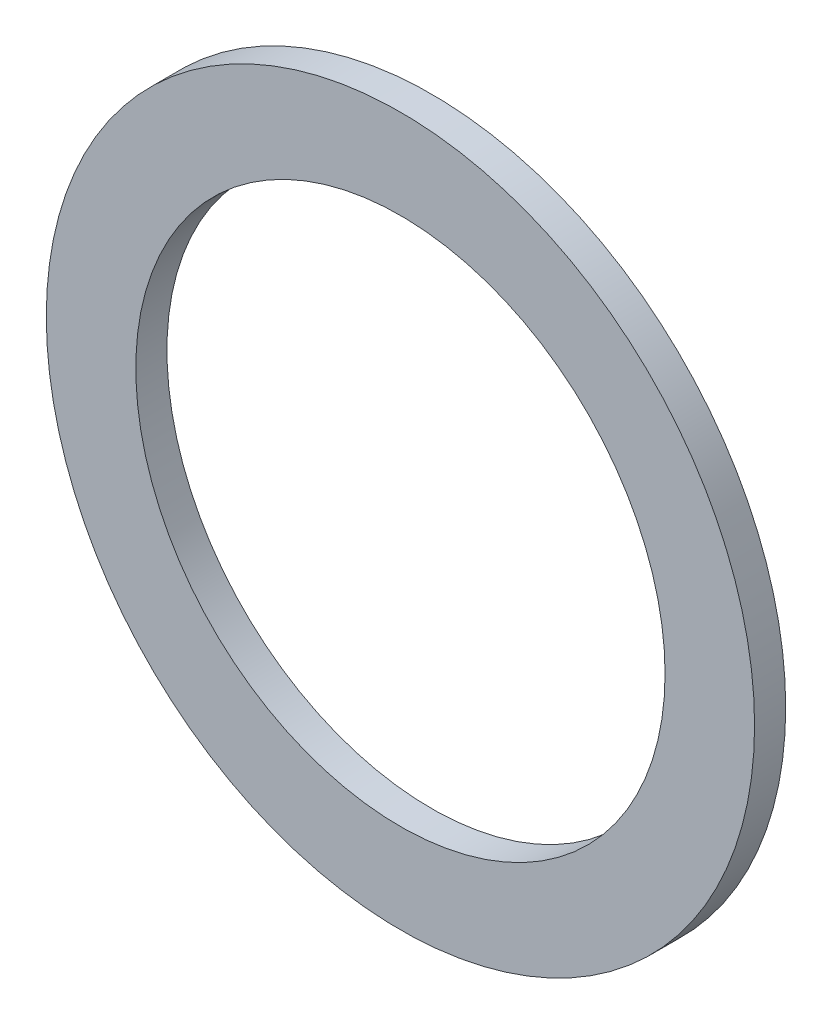
ISO-10303-21;
HEADER;
FILE_DESCRIPTION(('STEP AP214'),'2;1');
FILE_NAME('part.step','',(''),(''),'','','');
FILE_SCHEMA(('AUTOMOTIVE_DESIGN { 1 0 10303 214 1 1 1 1 }'));
ENDSEC;
DATA;
#1=APPLICATION_CONTEXT('core data for automotive mechanical design processes');
#2=APPLICATION_PROTOCOL_DEFINITION('international standard','automotive_design',2000,#1);
#3=PRODUCT_CONTEXT('',#1,'mechanical');
#4=PRODUCT('Part','Part','',(#3));
#5=PRODUCT_RELATED_PRODUCT_CATEGORY('part','',(#4));
#6=PRODUCT_DEFINITION_FORMATION('','',#4);
#7=PRODUCT_DEFINITION_CONTEXT('part definition',#1,'design');
#8=PRODUCT_DEFINITION('design','',#6,#7);
#9=PRODUCT_DEFINITION_SHAPE('','',#8);
#10=(LENGTH_UNIT() NAMED_UNIT(*) SI_UNIT(.MILLI.,.METRE.));
#11=(NAMED_UNIT(*) PLANE_ANGLE_UNIT() SI_UNIT($,.RADIAN.));
#12=(NAMED_UNIT(*) SI_UNIT($,.STERADIAN.) SOLID_ANGLE_UNIT());
#13=UNCERTAINTY_MEASURE_WITH_UNIT(LENGTH_MEASURE(1.E-05),#10,'distance_accuracy_value','');
#14=(GEOMETRIC_REPRESENTATION_CONTEXT(3) GLOBAL_UNCERTAINTY_ASSIGNED_CONTEXT((#13)) GLOBAL_UNIT_ASSIGNED_CONTEXT((#10,
#11,#12)) REPRESENTATION_CONTEXT('',''));
#15=CARTESIAN_POINT('',(0.,0.,0.));
#16=DIRECTION('',(0.,0.,1.));
#17=DIRECTION('',(1.,0.,0.));
#18=AXIS2_PLACEMENT_3D('',#15,#16,#17);
#19=CARTESIAN_POINT('',(0.,0.,2.));
#20=DIRECTION('',(0.,0.,1.));
#21=DIRECTION('',(1.,0.,0.));
#22=AXIS2_PLACEMENT_3D('',#19,#20,#21);
#23=PLANE('',#22);
#24=CARTESIAN_POINT('',(0.,0.,2.));
#25=DIRECTION('',(0.,0.,1.));
#26=DIRECTION('',(1.,0.,0.));
#27=AXIS2_PLACEMENT_3D('',#24,#25,#26);
#28=CIRCLE('',#27,22.75);
#29=CARTESIAN_POINT('',(22.75,0.,2.));
#30=VERTEX_POINT('',#29);
#31=EDGE_CURVE('E10',#30,#30,#28,.T.);
#32=ORIENTED_EDGE('',*,*,#31,.T.);
#33=EDGE_LOOP('',(#32));
#34=FACE_BOUND('',#33,.T.);
#35=CARTESIAN_POINT('',(0.,0.,2.));
#36=DIRECTION('',(0.,0.,1.));
#37=DIRECTION('',(1.,0.,0.));
#38=AXIS2_PLACEMENT_3D('',#35,#36,#37);
#39=CIRCLE('',#38,17.);
#40=CARTESIAN_POINT('',(17.,0.,2.));
#41=VERTEX_POINT('',#40);
#42=EDGE_CURVE('E39',#41,#41,#39,.T.);
#43=ORIENTED_EDGE('',*,*,#42,.F.);
#44=EDGE_LOOP('',(#43));
#45=FACE_BOUND('',#44,.T.);
#46=ADVANCED_FACE('F28',(#34,#45),#23,.T.);
#47=CARTESIAN_POINT('',(0.,0.,0.));
#48=DIRECTION('',(0.,0.,1.));
#49=DIRECTION('',(1.,0.,0.));
#50=AXIS2_PLACEMENT_3D('',#47,#48,#49);
#51=PLANE('',#50);
#52=CARTESIAN_POINT('',(0.,0.,0.));
#53=DIRECTION('',(0.,0.,1.));
#54=DIRECTION('',(1.,0.,0.));
#55=AXIS2_PLACEMENT_3D('',#52,#53,#54);
#56=CIRCLE('',#55,22.75);
#57=CARTESIAN_POINT('',(22.75,0.,0.));
#58=VERTEX_POINT('',#57);
#59=EDGE_CURVE('E32',#58,#58,#56,.T.);
#60=ORIENTED_EDGE('',*,*,#59,.F.);
#61=EDGE_LOOP('',(#60));
#62=FACE_BOUND('',#61,.T.);
#63=CARTESIAN_POINT('',(0.,0.,0.));
#64=DIRECTION('',(0.,0.,1.));
#65=DIRECTION('',(1.,0.,0.));
#66=AXIS2_PLACEMENT_3D('',#63,#64,#65);
#67=CIRCLE('',#66,17.);
#68=CARTESIAN_POINT('',(17.,0.,0.));
#69=VERTEX_POINT('',#68);
#70=EDGE_CURVE('E41',#69,#69,#67,.T.);
#71=ORIENTED_EDGE('',*,*,#70,.T.);
#72=EDGE_LOOP('',(#71));
#73=FACE_BOUND('',#72,.T.);
#74=ADVANCED_FACE('F51',(#62,#73),#51,.F.);
#75=CARTESIAN_POINT('',(0.,0.,2.));
#76=DIRECTION('',(0.,0.,-1.));
#77=DIRECTION('',(-1.,0.,0.));
#78=AXIS2_PLACEMENT_3D('',#75,#76,#77);
#79=CYLINDRICAL_SURFACE('',#78,22.75);
#80=ORIENTED_EDGE('',*,*,#31,.F.);
#81=EDGE_LOOP('',(#80));
#82=FACE_BOUND('',#81,.T.);
#83=ORIENTED_EDGE('',*,*,#59,.T.);
#84=EDGE_LOOP('',(#83));
#85=FACE_BOUND('',#84,.T.);
#86=ADVANCED_FACE('F30',(#82,#85),#79,.T.);
#87=CARTESIAN_POINT('',(0.,0.,2.));
#88=DIRECTION('',(0.,0.,-1.));
#89=DIRECTION('',(-1.,0.,0.));
#90=AXIS2_PLACEMENT_3D('',#87,#88,#89);
#91=CYLINDRICAL_SURFACE('',#90,17.);
#92=ORIENTED_EDGE('',*,*,#42,.T.);
#93=EDGE_LOOP('',(#92));
#94=FACE_BOUND('',#93,.T.);
#95=ORIENTED_EDGE('',*,*,#70,.F.);
#96=EDGE_LOOP('',(#95));
#97=FACE_BOUND('',#96,.T.);
#98=ADVANCED_FACE('F47',(#94,#97),#91,.F.);
#99=CLOSED_SHELL('',(#46,#74,#86,#98));
#100=MANIFOLD_SOLID_BREP('B2',#99);
#101=ADVANCED_BREP_SHAPE_REPRESENTATION('',(#18,#100),#14);
#102=SHAPE_DEFINITION_REPRESENTATION(#9,#101);
ENDSEC;
END-ISO-10303-21;
